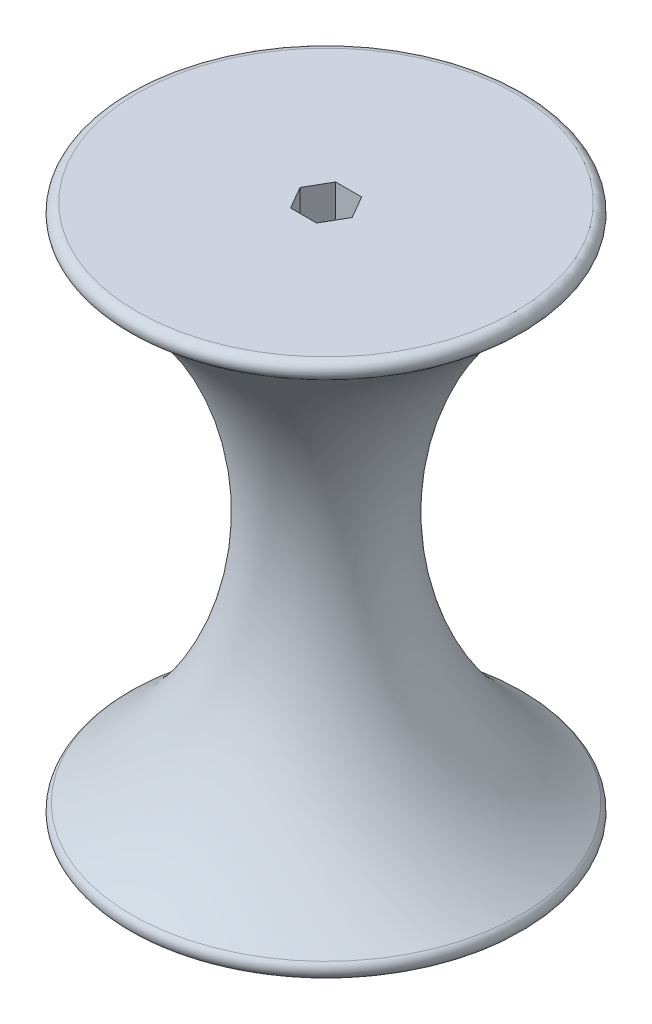
ISO-10303-21;
HEADER;
FILE_DESCRIPTION(('STEP AP214'),'2;1');
FILE_NAME('part.step','',(''),(''),'','','');
FILE_SCHEMA(('AUTOMOTIVE_DESIGN { 1 0 10303 214 1 1 1 1 }'));
ENDSEC;
DATA;
#1=APPLICATION_CONTEXT('core data for automotive mechanical design processes');
#2=APPLICATION_PROTOCOL_DEFINITION('international standard','automotive_design',2000,#1);
#3=PRODUCT_CONTEXT('',#1,'mechanical');
#4=PRODUCT('Part','Part','',(#3));
#5=PRODUCT_RELATED_PRODUCT_CATEGORY('part','',(#4));
#6=PRODUCT_DEFINITION_FORMATION('','',#4);
#7=PRODUCT_DEFINITION_CONTEXT('part definition',#1,'design');
#8=PRODUCT_DEFINITION('design','',#6,#7);
#9=PRODUCT_DEFINITION_SHAPE('','',#8);
#10=(LENGTH_UNIT() NAMED_UNIT(*) SI_UNIT(.MILLI.,.METRE.));
#11=(NAMED_UNIT(*) PLANE_ANGLE_UNIT() SI_UNIT($,.RADIAN.));
#12=(NAMED_UNIT(*) SI_UNIT($,.STERADIAN.) SOLID_ANGLE_UNIT());
#13=UNCERTAINTY_MEASURE_WITH_UNIT(LENGTH_MEASURE(1.E-05),#10,'distance_accuracy_value','');
#14=(GEOMETRIC_REPRESENTATION_CONTEXT(3) GLOBAL_UNCERTAINTY_ASSIGNED_CONTEXT((#13)) GLOBAL_UNIT_ASSIGNED_CONTEXT((#10,
#11,#12)) REPRESENTATION_CONTEXT('',''));
#15=CARTESIAN_POINT('',(0.,0.,0.));
#16=DIRECTION('',(0.,0.,1.));
#17=DIRECTION('',(1.,0.,0.));
#18=AXIS2_PLACEMENT_3D('',#15,#16,#17);
#19=CARTESIAN_POINT('',(0.,-73.66,0.));
#20=DIRECTION('',(0.,-1.,0.));
#21=DIRECTION('',(0.,0.,-1.));
#22=AXIS2_PLACEMENT_3D('',#19,#20,#21);
#23=TOROIDAL_SURFACE('',#22,53.7699483204381,2.54000000000001);
#24=CARTESIAN_POINT('',(0.,-71.6138888888889,0.));
#25=DIRECTION('',(0.,-1.,0.));
#26=DIRECTION('',(0.,0.,-1.));
#27=AXIS2_PLACEMENT_3D('',#24,#25,#26);
#28=CIRCLE('',#27,55.2749497559815);
#29=CARTESIAN_POINT('',(0.,-71.6138888888889,-55.2749497559815));
#30=VERTEX_POINT('',#29);
#31=EDGE_CURVE('E133',#30,#30,#28,.T.);
#32=ORIENTED_EDGE('',*,*,#31,.T.);
#33=EDGE_LOOP('',(#32));
#34=FACE_BOUND('',#33,.T.);
#35=CARTESIAN_POINT('',(0.,-76.2,0.));
#36=DIRECTION('',(0.,-1.,0.));
#37=DIRECTION('',(0.,0.,-1.));
#38=AXIS2_PLACEMENT_3D('',#35,#36,#37);
#39=CIRCLE('',#38,53.7699483204381);
#40=CARTESIAN_POINT('',(0.,-76.2,-53.7699483204381));
#41=VERTEX_POINT('',#40);
#42=EDGE_CURVE('E11',#41,#41,#39,.T.);
#43=ORIENTED_EDGE('',*,*,#42,.F.);
#44=EDGE_LOOP('',(#43));
#45=FACE_BOUND('',#44,.T.);
#46=ADVANCED_FACE('F36',(#34,#45),#23,.T.);
#47=CARTESIAN_POINT('',(0.,-76.2,0.));
#48=DIRECTION('',(0.,-1.,0.));
#49=DIRECTION('',(0.,0.,-1.));
#50=AXIS2_PLACEMENT_3D('',#47,#48,#49);
#51=PLANE('',#50);
#52=DIRECTION('',(-0.500000000000001,0.,-0.866025403784438));
#53=VECTOR('',#52,1.);
#54=CARTESIAN_POINT('',(3.70283595144767,-76.2,-6.4135));
#55=LINE('',#54,#53);
#56=CARTESIAN_POINT('',(7.40567190289534,-76.2,0.));
#57=VERTEX_POINT('',#56);
#58=CARTESIAN_POINT('',(3.70283595144767,-76.2,-6.4135));
#59=VERTEX_POINT('',#58);
#60=EDGE_CURVE('E90',#57,#59,#55,.T.);
#61=ORIENTED_EDGE('',*,*,#60,.T.);
#62=DIRECTION('',(-1.,0.,0.));
#63=VECTOR('',#62,1.);
#64=CARTESIAN_POINT('',(-3.70283595144767,-76.2,-6.4135));
#65=LINE('',#64,#63);
#66=CARTESIAN_POINT('',(-3.70283595144767,-76.2,-6.4135));
#67=VERTEX_POINT('',#66);
#68=EDGE_CURVE('E99',#59,#67,#65,.T.);
#69=ORIENTED_EDGE('',*,*,#68,.T.);
#70=DIRECTION('',(-0.500000000000001,0.,0.866025403784438));
#71=VECTOR('',#70,1.);
#72=CARTESIAN_POINT('',(-7.40567190289534,-76.2,0.));
#73=LINE('',#72,#71);
#74=CARTESIAN_POINT('',(-7.40567190289534,-76.2,0.));
#75=VERTEX_POINT('',#74);
#76=EDGE_CURVE('E50',#67,#75,#73,.T.);
#77=ORIENTED_EDGE('',*,*,#76,.T.);
#78=DIRECTION('',(0.500000000000001,0.,0.866025403784438));
#79=VECTOR('',#78,1.);
#80=CARTESIAN_POINT('',(-3.70283595144767,-76.2,6.4135));
#81=LINE('',#80,#79);
#82=CARTESIAN_POINT('',(-3.70283595144767,-76.2,6.4135));
#83=VERTEX_POINT('',#82);
#84=EDGE_CURVE('E114',#75,#83,#81,.T.);
#85=ORIENTED_EDGE('',*,*,#84,.T.);
#86=DIRECTION('',(1.,0.,0.));
#87=VECTOR('',#86,1.);
#88=CARTESIAN_POINT('',(3.70283595144767,-76.2,6.4135));
#89=LINE('',#88,#87);
#90=CARTESIAN_POINT('',(3.70283595144767,-76.2,6.4135));
#91=VERTEX_POINT('',#90);
#92=EDGE_CURVE('E117',#83,#91,#89,.T.);
#93=ORIENTED_EDGE('',*,*,#92,.T.);
#94=DIRECTION('',(0.500000000000001,0.,-0.866025403784438));
#95=VECTOR('',#94,1.);
#96=CARTESIAN_POINT('',(7.40567190289534,-76.2,0.));
#97=LINE('',#96,#95);
#98=EDGE_CURVE('E96',#91,#57,#97,.T.);
#99=ORIENTED_EDGE('',*,*,#98,.T.);
#100=EDGE_LOOP('',(#61,#69,#77,#85,#93,#99));
#101=FACE_BOUND('',#100,.T.);
#102=ORIENTED_EDGE('',*,*,#42,.T.);
#103=EDGE_LOOP('',(#102));
#104=FACE_BOUND('',#103,.T.);
#105=ADVANCED_FACE('F103',(#101,#104),#51,.T.);
#106=CARTESIAN_POINT('',(0.,76.2,0.));
#107=DIRECTION('',(0.,1.,0.));
#108=DIRECTION('',(0.,0.,1.));
#109=AXIS2_PLACEMENT_3D('',#106,#107,#108);
#110=PLANE('',#109);
#111=DIRECTION('',(-0.500000000000001,0.,-0.866025403784438));
#112=VECTOR('',#111,1.);
#113=CARTESIAN_POINT('',(3.70283595144767,76.2,-6.4135));
#114=LINE('',#113,#112);
#115=CARTESIAN_POINT('',(7.40567190289534,76.2,0.));
#116=VERTEX_POINT('',#115);
#117=CARTESIAN_POINT('',(3.70283595144767,76.2,-6.4135));
#118=VERTEX_POINT('',#117);
#119=EDGE_CURVE('E58',#116,#118,#114,.T.);
#120=ORIENTED_EDGE('',*,*,#119,.F.);
#121=DIRECTION('',(0.500000000000001,0.,-0.866025403784438));
#122=VECTOR('',#121,1.);
#123=CARTESIAN_POINT('',(7.40567190289534,76.2,0.));
#124=LINE('',#123,#122);
#125=CARTESIAN_POINT('',(3.70283595144767,76.2,6.4135));
#126=VERTEX_POINT('',#125);
#127=EDGE_CURVE('E107',#126,#116,#124,.T.);
#128=ORIENTED_EDGE('',*,*,#127,.F.);
#129=DIRECTION('',(1.,0.,0.));
#130=VECTOR('',#129,1.);
#131=CARTESIAN_POINT('',(3.70283595144767,76.2,6.4135));
#132=LINE('',#131,#130);
#133=CARTESIAN_POINT('',(-3.70283595144767,76.2,6.4135));
#134=VERTEX_POINT('',#133);
#135=EDGE_CURVE('E110',#134,#126,#132,.T.);
#136=ORIENTED_EDGE('',*,*,#135,.F.);
#137=DIRECTION('',(0.500000000000001,0.,0.866025403784438));
#138=VECTOR('',#137,1.);
#139=CARTESIAN_POINT('',(-3.70283595144767,76.2,6.4135));
#140=LINE('',#139,#138);
#141=CARTESIAN_POINT('',(-7.40567190289534,76.2,0.));
#142=VERTEX_POINT('',#141);
#143=EDGE_CURVE('E126',#142,#134,#140,.T.);
#144=ORIENTED_EDGE('',*,*,#143,.F.);
#145=DIRECTION('',(-0.500000000000001,0.,0.866025403784438));
#146=VECTOR('',#145,1.);
#147=CARTESIAN_POINT('',(-7.40567190289534,76.2,0.));
#148=LINE('',#147,#146);
#149=CARTESIAN_POINT('',(-3.70283595144767,76.2,-6.4135));
#150=VERTEX_POINT('',#149);
#151=EDGE_CURVE('E123',#150,#142,#148,.T.);
#152=ORIENTED_EDGE('',*,*,#151,.F.);
#153=DIRECTION('',(-1.,0.,0.));
#154=VECTOR('',#153,1.);
#155=CARTESIAN_POINT('',(-3.70283595144767,76.2,-6.4135));
#156=LINE('',#155,#154);
#157=EDGE_CURVE('E121',#118,#150,#156,.T.);
#158=ORIENTED_EDGE('',*,*,#157,.F.);
#159=EDGE_LOOP('',(#120,#128,#136,#144,#152,#158));
#160=FACE_BOUND('',#159,.T.);
#161=CARTESIAN_POINT('',(0.,76.2,0.));
#162=DIRECTION('',(0.,-1.,0.));
#163=DIRECTION('',(0.,0.,-1.));
#164=AXIS2_PLACEMENT_3D('',#161,#162,#163);
#165=CIRCLE('',#164,53.7699483204381);
#166=CARTESIAN_POINT('',(0.,76.2,-53.7699483204381));
#167=VERTEX_POINT('',#166);
#168=EDGE_CURVE('E43',#167,#167,#165,.T.);
#169=ORIENTED_EDGE('',*,*,#168,.F.);
#170=EDGE_LOOP('',(#169));
#171=FACE_BOUND('',#170,.T.);
#172=ADVANCED_FACE('F151',(#160,#171),#110,.T.);
#173=CARTESIAN_POINT('',(0.,73.66,0.));
#174=DIRECTION('',(0.,-1.,0.));
#175=DIRECTION('',(0.,0.,-1.));
#176=AXIS2_PLACEMENT_3D('',#173,#174,#175);
#177=TOROIDAL_SURFACE('',#176,53.7699483204381,2.54000000000001);
#178=ORIENTED_EDGE('',*,*,#168,.T.);
#179=EDGE_LOOP('',(#178));
#180=FACE_BOUND('',#179,.T.);
#181=CARTESIAN_POINT('',(0.,71.6138888888889,0.));
#182=DIRECTION('',(0.,-1.,0.));
#183=DIRECTION('',(0.,0.,-1.));
#184=AXIS2_PLACEMENT_3D('',#181,#182,#183);
#185=CIRCLE('',#184,55.2749497559815);
#186=CARTESIAN_POINT('',(0.,71.6138888888889,-55.2749497559815));
#187=VERTEX_POINT('',#186);
#188=EDGE_CURVE('E143',#187,#187,#185,.T.);
#189=ORIENTED_EDGE('',*,*,#188,.F.);
#190=EDGE_LOOP('',(#189));
#191=FACE_BOUND('',#190,.T.);
#192=ADVANCED_FACE('F148',(#180,#191),#177,.T.);
#193=CARTESIAN_POINT('',(0.,0.,0.));
#194=DIRECTION('',(0.,-1.,0.));
#195=DIRECTION('',(0.,0.,-1.));
#196=AXIS2_PLACEMENT_3D('',#193,#194,#195);
#197=TOROIDAL_SURFACE('',#196,107.95,88.9);
#198=ORIENTED_EDGE('',*,*,#188,.T.);
#199=EDGE_LOOP('',(#198));
#200=FACE_BOUND('',#199,.T.);
#201=ORIENTED_EDGE('',*,*,#31,.F.);
#202=EDGE_LOOP('',(#201));
#203=FACE_BOUND('',#202,.T.);
#204=ADVANCED_FACE('F159',(#200,#203),#197,.F.);
#205=CARTESIAN_POINT('',(3.70283595144767,-76.2,-6.4135));
#206=DIRECTION('',(0.866025403784438,0.,-0.500000000000001));
#207=DIRECTION('',(-0.500000000000001,0.,-0.866025403784438));
#208=AXIS2_PLACEMENT_3D('',#205,#206,#207);
#209=PLANE('',#208);
#210=ORIENTED_EDGE('',*,*,#119,.T.);
#211=DIRECTION('',(0.,1.,0.));
#212=VECTOR('',#211,1.);
#213=CARTESIAN_POINT('',(3.70283595144767,-76.2,-6.4135));
#214=LINE('',#213,#212);
#215=EDGE_CURVE('E86',#59,#118,#214,.T.);
#216=ORIENTED_EDGE('',*,*,#215,.F.);
#217=ORIENTED_EDGE('',*,*,#60,.F.);
#218=DIRECTION('',(0.,1.,0.));
#219=VECTOR('',#218,1.);
#220=CARTESIAN_POINT('',(7.40567190289534,-76.2,0.));
#221=LINE('',#220,#219);
#222=EDGE_CURVE('E131',#57,#116,#221,.T.);
#223=ORIENTED_EDGE('',*,*,#222,.T.);
#224=EDGE_LOOP('',(#210,#216,#217,#223));
#225=FACE_BOUND('',#224,.T.);
#226=ADVANCED_FACE('F88',(#225),#209,.F.);
#227=CARTESIAN_POINT('',(7.40567190289534,-76.2,0.));
#228=DIRECTION('',(0.866025403784438,0.,0.500000000000001));
#229=DIRECTION('',(0.500000000000001,0.,-0.866025403784438));
#230=AXIS2_PLACEMENT_3D('',#227,#228,#229);
#231=PLANE('',#230);
#232=ORIENTED_EDGE('',*,*,#127,.T.);
#233=ORIENTED_EDGE('',*,*,#222,.F.);
#234=ORIENTED_EDGE('',*,*,#98,.F.);
#235=DIRECTION('',(0.,1.,0.));
#236=VECTOR('',#235,1.);
#237=CARTESIAN_POINT('',(3.70283595144767,-76.2,6.4135));
#238=LINE('',#237,#236);
#239=EDGE_CURVE('E134',#91,#126,#238,.T.);
#240=ORIENTED_EDGE('',*,*,#239,.T.);
#241=EDGE_LOOP('',(#232,#233,#234,#240));
#242=FACE_BOUND('',#241,.T.);
#243=ADVANCED_FACE('F175',(#242),#231,.F.);
#244=CARTESIAN_POINT('',(3.70283595144767,-76.2,6.4135));
#245=DIRECTION('',(0.,0.,1.));
#246=DIRECTION('',(1.,0.,0.));
#247=AXIS2_PLACEMENT_3D('',#244,#245,#246);
#248=PLANE('',#247);
#249=ORIENTED_EDGE('',*,*,#135,.T.);
#250=ORIENTED_EDGE('',*,*,#239,.F.);
#251=ORIENTED_EDGE('',*,*,#92,.F.);
#252=DIRECTION('',(0.,1.,0.));
#253=VECTOR('',#252,1.);
#254=CARTESIAN_POINT('',(-3.70283595144767,-76.2,6.4135));
#255=LINE('',#254,#253);
#256=EDGE_CURVE('E136',#83,#134,#255,.T.);
#257=ORIENTED_EDGE('',*,*,#256,.T.);
#258=EDGE_LOOP('',(#249,#250,#251,#257));
#259=FACE_BOUND('',#258,.T.);
#260=ADVANCED_FACE('F186',(#259),#248,.F.);
#261=CARTESIAN_POINT('',(-3.70283595144767,-76.2,6.4135));
#262=DIRECTION('',(-0.866025403784438,0.,0.500000000000001));
#263=DIRECTION('',(0.500000000000001,0.,0.866025403784438));
#264=AXIS2_PLACEMENT_3D('',#261,#262,#263);
#265=PLANE('',#264);
#266=ORIENTED_EDGE('',*,*,#143,.T.);
#267=ORIENTED_EDGE('',*,*,#256,.F.);
#268=ORIENTED_EDGE('',*,*,#84,.F.);
#269=DIRECTION('',(0.,1.,0.));
#270=VECTOR('',#269,1.);
#271=CARTESIAN_POINT('',(-7.40567190289534,-76.2,0.));
#272=LINE('',#271,#270);
#273=EDGE_CURVE('E138',#75,#142,#272,.T.);
#274=ORIENTED_EDGE('',*,*,#273,.T.);
#275=EDGE_LOOP('',(#266,#267,#268,#274));
#276=FACE_BOUND('',#275,.T.);
#277=ADVANCED_FACE('F183',(#276),#265,.F.);
#278=CARTESIAN_POINT('',(-7.40567190289534,-76.2,0.));
#279=DIRECTION('',(-0.866025403784438,0.,-0.500000000000001));
#280=DIRECTION('',(-0.500000000000001,0.,0.866025403784438));
#281=AXIS2_PLACEMENT_3D('',#278,#279,#280);
#282=PLANE('',#281);
#283=ORIENTED_EDGE('',*,*,#151,.T.);
#284=ORIENTED_EDGE('',*,*,#273,.F.);
#285=ORIENTED_EDGE('',*,*,#76,.F.);
#286=DIRECTION('',(0.,1.,0.));
#287=VECTOR('',#286,1.);
#288=CARTESIAN_POINT('',(-3.70283595144767,-76.2,-6.4135));
#289=LINE('',#288,#287);
#290=EDGE_CURVE('E95',#67,#150,#289,.T.);
#291=ORIENTED_EDGE('',*,*,#290,.T.);
#292=EDGE_LOOP('',(#283,#284,#285,#291));
#293=FACE_BOUND('',#292,.T.);
#294=ADVANCED_FACE('F180',(#293),#282,.F.);
#295=CARTESIAN_POINT('',(-3.70283595144767,-76.2,-6.4135));
#296=DIRECTION('',(0.,0.,-1.));
#297=DIRECTION('',(-1.,0.,0.));
#298=AXIS2_PLACEMENT_3D('',#295,#296,#297);
#299=PLANE('',#298);
#300=ORIENTED_EDGE('',*,*,#157,.T.);
#301=ORIENTED_EDGE('',*,*,#290,.F.);
#302=ORIENTED_EDGE('',*,*,#68,.F.);
#303=ORIENTED_EDGE('',*,*,#215,.T.);
#304=EDGE_LOOP('',(#300,#301,#302,#303));
#305=FACE_BOUND('',#304,.T.);
#306=ADVANCED_FACE('F100',(#305),#299,.F.);
#307=CLOSED_SHELL('',(#46,#105,#172,#192,#204,#226,#243,#260,#277,#294,#306));
#308=MANIFOLD_SOLID_BREP('B2',#307);
#309=ADVANCED_BREP_SHAPE_REPRESENTATION('',(#18,#308),#14);
#310=SHAPE_DEFINITION_REPRESENTATION(#9,#309);
ENDSEC;
END-ISO-10303-21;
